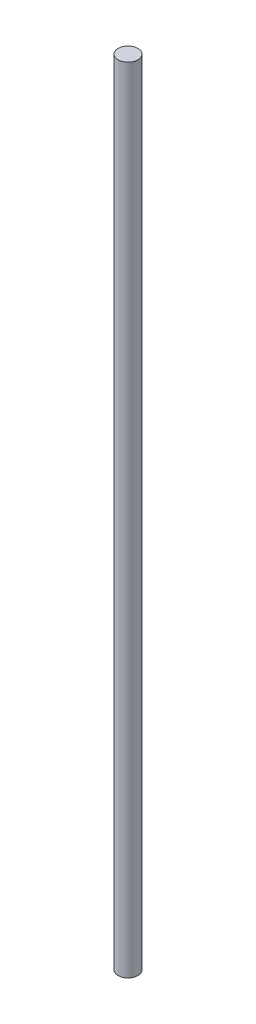
ISO-10303-21;
HEADER;
FILE_DESCRIPTION(('STEP AP214'),'2;1');
FILE_NAME('part.step','',(''),(''),'','','');
FILE_SCHEMA(('AUTOMOTIVE_DESIGN { 1 0 10303 214 1 1 1 1 }'));
ENDSEC;
DATA;
#1=APPLICATION_CONTEXT('core data for automotive mechanical design processes');
#2=APPLICATION_PROTOCOL_DEFINITION('international standard','automotive_design',2000,#1);
#3=PRODUCT_CONTEXT('',#1,'mechanical');
#4=PRODUCT('Part','Part','',(#3));
#5=PRODUCT_RELATED_PRODUCT_CATEGORY('part','',(#4));
#6=PRODUCT_DEFINITION_FORMATION('','',#4);
#7=PRODUCT_DEFINITION_CONTEXT('part definition',#1,'design');
#8=PRODUCT_DEFINITION('design','',#6,#7);
#9=PRODUCT_DEFINITION_SHAPE('','',#8);
#10=(LENGTH_UNIT() NAMED_UNIT(*) SI_UNIT(.MILLI.,.METRE.));
#11=(NAMED_UNIT(*) PLANE_ANGLE_UNIT() SI_UNIT($,.RADIAN.));
#12=(NAMED_UNIT(*) SI_UNIT($,.STERADIAN.) SOLID_ANGLE_UNIT());
#13=UNCERTAINTY_MEASURE_WITH_UNIT(LENGTH_MEASURE(1.E-05),#10,'distance_accuracy_value','');
#14=(GEOMETRIC_REPRESENTATION_CONTEXT(3) GLOBAL_UNCERTAINTY_ASSIGNED_CONTEXT((#13)) GLOBAL_UNIT_ASSIGNED_CONTEXT((#10,
#11,#12)) REPRESENTATION_CONTEXT('',''));
#15=CARTESIAN_POINT('',(0.,0.,0.));
#16=DIRECTION('',(0.,0.,1.));
#17=DIRECTION('',(1.,0.,0.));
#18=AXIS2_PLACEMENT_3D('',#15,#16,#17);
#19=CARTESIAN_POINT('',(0.,400.,0.));
#20=DIRECTION('',(0.,-1.,0.));
#21=DIRECTION('',(1.,0.,0.));
#22=AXIS2_PLACEMENT_3D('',#19,#20,#21);
#23=CYLINDRICAL_SURFACE('',#22,5.00000000000002);
#24=CARTESIAN_POINT('',(0.,400.,0.));
#25=DIRECTION('',(0.,-1.,0.));
#26=DIRECTION('',(1.,0.,0.));
#27=AXIS2_PLACEMENT_3D('',#24,#25,#26);
#28=CIRCLE('',#27,5.00000000000005);
#29=CARTESIAN_POINT('',(5.,400.,0.));
#30=VERTEX_POINT('',#29);
#31=EDGE_CURVE('E10',#30,#30,#28,.T.);
#32=ORIENTED_EDGE('',*,*,#31,.T.);
#33=EDGE_LOOP('',(#32));
#34=FACE_BOUND('',#33,.T.);
#35=CARTESIAN_POINT('',(0.,0.,0.));
#36=DIRECTION('',(0.,-1.,0.));
#37=DIRECTION('',(1.,0.,0.));
#38=AXIS2_PLACEMENT_3D('',#35,#36,#37);
#39=CIRCLE('',#38,5.);
#40=CARTESIAN_POINT('',(5.,0.,0.));
#41=VERTEX_POINT('',#40);
#42=EDGE_CURVE('E37',#41,#41,#39,.T.);
#43=ORIENTED_EDGE('',*,*,#42,.F.);
#44=EDGE_LOOP('',(#43));
#45=FACE_BOUND('',#44,.T.);
#46=ADVANCED_FACE('F31',(#34,#45),#23,.T.);
#47=CARTESIAN_POINT('',(5.,400.,0.));
#48=DIRECTION('',(0.,1.,0.));
#49=DIRECTION('',(-1.,0.,0.));
#50=AXIS2_PLACEMENT_3D('',#47,#48,#49);
#51=PLANE('',#50);
#52=ORIENTED_EDGE('',*,*,#31,.F.);
#53=EDGE_LOOP('',(#52));
#54=FACE_BOUND('',#53,.T.);
#55=ADVANCED_FACE('F46',(#54),#51,.T.);
#56=CARTESIAN_POINT('',(0.,0.,0.));
#57=DIRECTION('',(0.,-1.,0.));
#58=DIRECTION('',(1.,0.,0.));
#59=AXIS2_PLACEMENT_3D('',#56,#57,#58);
#60=PLANE('',#59);
#61=ORIENTED_EDGE('',*,*,#42,.T.);
#62=EDGE_LOOP('',(#61));
#63=FACE_BOUND('',#62,.T.);
#64=ADVANCED_FACE('F43',(#63),#60,.T.);
#65=CLOSED_SHELL('',(#46,#55,#64));
#66=MANIFOLD_SOLID_BREP('B2',#65);
#67=ADVANCED_BREP_SHAPE_REPRESENTATION('',(#18,#66),#14);
#68=SHAPE_DEFINITION_REPRESENTATION(#9,#67);
ENDSEC;
END-ISO-10303-21;
